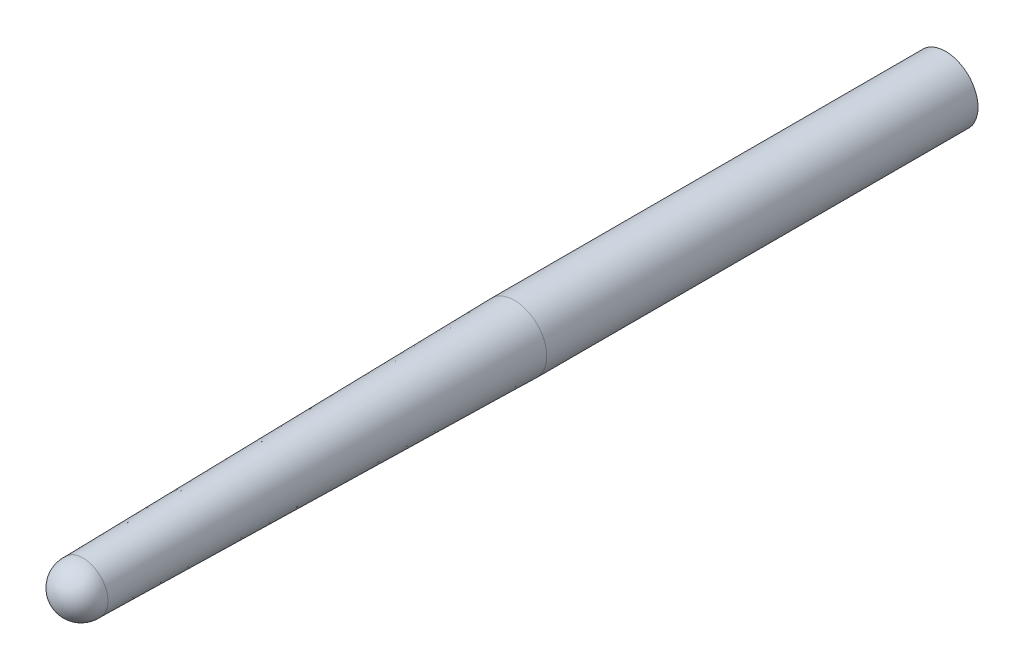
ISO-10303-21;
HEADER;
FILE_DESCRIPTION(('STEP AP214'),'2;1');
FILE_NAME('part.step','',(''),(''),'','','');
FILE_SCHEMA(('AUTOMOTIVE_DESIGN { 1 0 10303 214 1 1 1 1 }'));
ENDSEC;
DATA;
#1=APPLICATION_CONTEXT('core data for automotive mechanical design processes');
#2=APPLICATION_PROTOCOL_DEFINITION('international standard','automotive_design',2000,#1);
#3=PRODUCT_CONTEXT('',#1,'mechanical');
#4=PRODUCT('Part','Part','',(#3));
#5=PRODUCT_RELATED_PRODUCT_CATEGORY('part','',(#4));
#6=PRODUCT_DEFINITION_FORMATION('','',#4);
#7=PRODUCT_DEFINITION_CONTEXT('part definition',#1,'design');
#8=PRODUCT_DEFINITION('design','',#6,#7);
#9=PRODUCT_DEFINITION_SHAPE('','',#8);
#10=(LENGTH_UNIT() NAMED_UNIT(*) SI_UNIT(.MILLI.,.METRE.));
#11=(NAMED_UNIT(*) PLANE_ANGLE_UNIT() SI_UNIT($,.RADIAN.));
#12=(NAMED_UNIT(*) SI_UNIT($,.STERADIAN.) SOLID_ANGLE_UNIT());
#13=UNCERTAINTY_MEASURE_WITH_UNIT(LENGTH_MEASURE(1.E-05),#10,'distance_accuracy_value','');
#14=(GEOMETRIC_REPRESENTATION_CONTEXT(3) GLOBAL_UNCERTAINTY_ASSIGNED_CONTEXT((#13)) GLOBAL_UNIT_ASSIGNED_CONTEXT((#10,
#11,#12)) REPRESENTATION_CONTEXT('',''));
#15=CARTESIAN_POINT('',(0.,0.,0.));
#16=DIRECTION('',(0.,0.,1.));
#17=DIRECTION('',(1.,0.,0.));
#18=AXIS2_PLACEMENT_3D('',#15,#16,#17);
#19=CARTESIAN_POINT('',(0.,0.,0.));
#20=DIRECTION('',(0.,0.,-1.));
#21=DIRECTION('',(-1.,0.,0.));
#22=AXIS2_PLACEMENT_3D('',#19,#20,#21);
#23=CONICAL_SURFACE('',#22,6.,0.0174532925199433);
#24=CARTESIAN_POINT('',(0.,0.,80.));
#25=DIRECTION('',(0.,0.,1.));
#26=DIRECTION('',(1.,0.,0.));
#27=AXIS2_PLACEMENT_3D('',#24,#25,#26);
#28=CIRCLE('',#27,4.60359480574259);
#29=CARTESIAN_POINT('',(4.60359480574259,0.,80.));
#30=VERTEX_POINT('',#29);
#31=EDGE_CURVE('E39',#30,#30,#28,.T.);
#32=ORIENTED_EDGE('',*,*,#31,.F.);
#33=EDGE_LOOP('',(#32));
#34=FACE_BOUND('',#33,.T.);
#35=CARTESIAN_POINT('',(0.,0.,0.));
#36=DIRECTION('',(0.,0.,-1.));
#37=DIRECTION('',(-1.,0.,0.));
#38=AXIS2_PLACEMENT_3D('',#35,#36,#37);
#39=CIRCLE('',#38,6.);
#40=CARTESIAN_POINT('',(-6.,0.,0.));
#41=VERTEX_POINT('',#40);
#42=EDGE_CURVE('E10',#41,#41,#39,.T.);
#43=ORIENTED_EDGE('',*,*,#42,.F.);
#44=EDGE_LOOP('',(#43));
#45=FACE_BOUND('',#44,.T.);
#46=ADVANCED_FACE('F35',(#34,#45),#23,.T.);
#47=CARTESIAN_POINT('',(0.,0.,80.));
#48=DIRECTION('',(0.,0.,-1.));
#49=DIRECTION('',(-1.,0.,0.));
#50=AXIS2_PLACEMENT_3D('',#47,#48,#49);
#51=CYLINDRICAL_SURFACE('',#50,6.);
#52=ORIENTED_EDGE('',*,*,#42,.T.);
#53=EDGE_LOOP('',(#52));
#54=FACE_BOUND('',#53,.T.);
#55=CARTESIAN_POINT('',(0.,0.,-80.));
#56=DIRECTION('',(0.,0.,1.));
#57=DIRECTION('',(1.,0.,0.));
#58=AXIS2_PLACEMENT_3D('',#55,#56,#57);
#59=CIRCLE('',#58,6.);
#60=CARTESIAN_POINT('',(6.,0.,-80.));
#61=VERTEX_POINT('',#60);
#62=EDGE_CURVE('E49',#61,#61,#59,.T.);
#63=ORIENTED_EDGE('',*,*,#62,.T.);
#64=EDGE_LOOP('',(#63));
#65=FACE_BOUND('',#64,.T.);
#66=ADVANCED_FACE('F54',(#54,#65),#51,.T.);
#67=CARTESIAN_POINT('',(0.,0.,80.380691486454));
#68=DIRECTION('',(0.,0.,1.));
#69=DIRECTION('',(1.,0.,0.));
#70=AXIS2_PLACEMENT_3D('',#67,#68,#69);
#71=SPHERICAL_SURFACE('',#70,4.61930851354602);
#72=ORIENTED_EDGE('',*,*,#31,.T.);
#73=EDGE_LOOP('',(#72));
#74=FACE_BOUND('',#73,.T.);
#75=ADVANCED_FACE('F37',(#74),#71,.T.);
#76=CARTESIAN_POINT('',(0.,0.,-80.));
#77=DIRECTION('',(0.,0.,1.));
#78=DIRECTION('',(1.,0.,0.));
#79=AXIS2_PLACEMENT_3D('',#76,#77,#78);
#80=PLANE('',#79);
#81=ORIENTED_EDGE('',*,*,#62,.F.);
#82=EDGE_LOOP('',(#81));
#83=FACE_BOUND('',#82,.T.);
#84=ADVANCED_FACE('F56',(#83),#80,.F.);
#85=CLOSED_SHELL('',(#46,#66,#75,#84));
#86=MANIFOLD_SOLID_BREP('B2',#85);
#87=ADVANCED_BREP_SHAPE_REPRESENTATION('',(#18,#86),#14);
#88=SHAPE_DEFINITION_REPRESENTATION(#9,#87);
ENDSEC;
END-ISO-10303-21;
